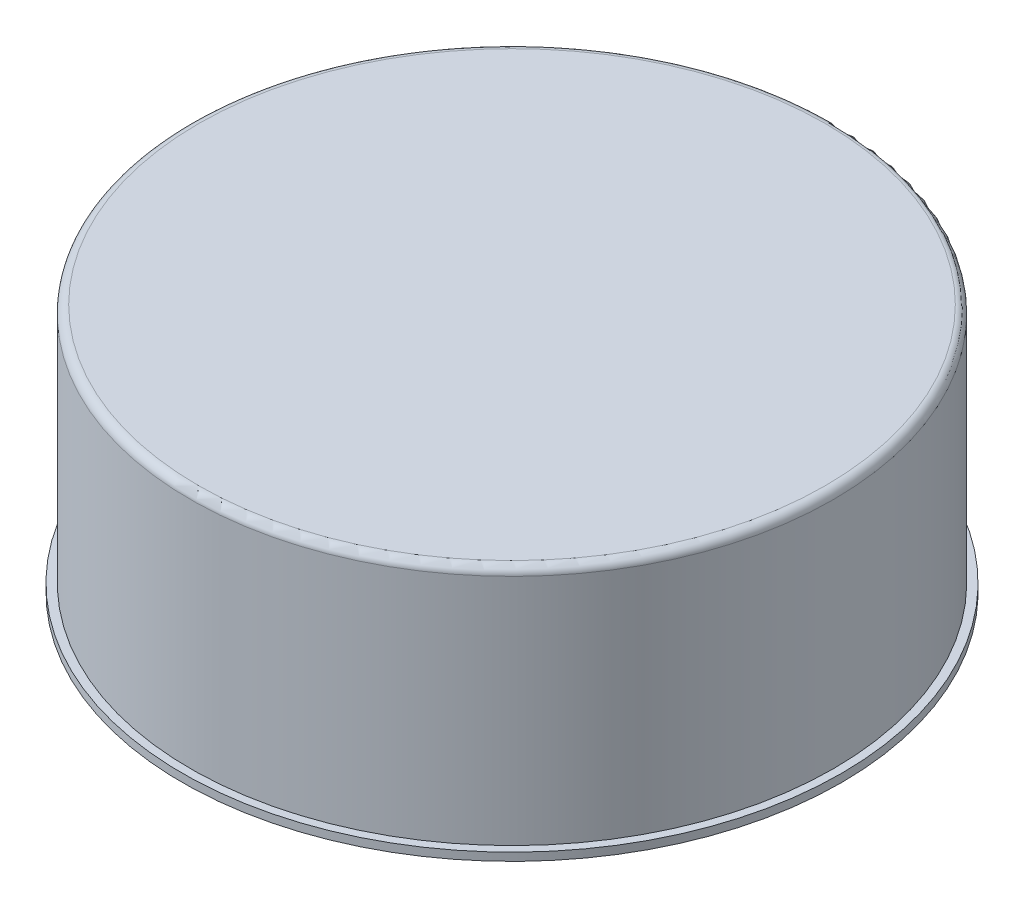
ISO-10303-21;
HEADER;
FILE_DESCRIPTION(('STEP AP214'),'2;1');
FILE_NAME('part.step','',(''),(''),'','','');
FILE_SCHEMA(('AUTOMOTIVE_DESIGN { 1 0 10303 214 1 1 1 1 }'));
ENDSEC;
DATA;
#1=APPLICATION_CONTEXT('core data for automotive mechanical design processes');
#2=APPLICATION_PROTOCOL_DEFINITION('international standard','automotive_design',2000,#1);
#3=PRODUCT_CONTEXT('',#1,'mechanical');
#4=PRODUCT('Part','Part','',(#3));
#5=PRODUCT_RELATED_PRODUCT_CATEGORY('part','',(#4));
#6=PRODUCT_DEFINITION_FORMATION('','',#4);
#7=PRODUCT_DEFINITION_CONTEXT('part definition',#1,'design');
#8=PRODUCT_DEFINITION('design','',#6,#7);
#9=PRODUCT_DEFINITION_SHAPE('','',#8);
#10=(LENGTH_UNIT() NAMED_UNIT(*) SI_UNIT(.MILLI.,.METRE.));
#11=(NAMED_UNIT(*) PLANE_ANGLE_UNIT() SI_UNIT($,.RADIAN.));
#12=(NAMED_UNIT(*) SI_UNIT($,.STERADIAN.) SOLID_ANGLE_UNIT());
#13=UNCERTAINTY_MEASURE_WITH_UNIT(LENGTH_MEASURE(1.E-05),#10,'distance_accuracy_value','');
#14=(GEOMETRIC_REPRESENTATION_CONTEXT(3) GLOBAL_UNCERTAINTY_ASSIGNED_CONTEXT((#13)) GLOBAL_UNIT_ASSIGNED_CONTEXT((#10,
#11,#12)) REPRESENTATION_CONTEXT('',''));
#15=CARTESIAN_POINT('',(0.,0.,0.));
#16=DIRECTION('',(0.,0.,1.));
#17=DIRECTION('',(1.,0.,0.));
#18=AXIS2_PLACEMENT_3D('',#15,#16,#17);
#19=CARTESIAN_POINT('',(0.,0.,0.));
#20=DIRECTION('',(0.,-1.,0.));
#21=DIRECTION('',(1.,0.,0.));
#22=AXIS2_PLACEMENT_3D('',#19,#20,#21);
#23=CYLINDRICAL_SURFACE('',#22,4100.);
#24=CARTESIAN_POINT('',(0.,-100.,0.));
#25=DIRECTION('',(0.,-1.,0.));
#26=DIRECTION('',(1.,0.,0.));
#27=AXIS2_PLACEMENT_3D('',#24,#25,#26);
#28=CIRCLE('',#27,4100.);
#29=CARTESIAN_POINT('',(4100.,-99.9999999999998,0.));
#30=VERTEX_POINT('',#29);
#31=EDGE_CURVE('E44',#30,#30,#28,.T.);
#32=ORIENTED_EDGE('',*,*,#31,.F.);
#33=EDGE_LOOP('',(#32));
#34=FACE_BOUND('',#33,.T.);
#35=CARTESIAN_POINT('',(0.,0.,0.));
#36=DIRECTION('',(0.,-1.,0.));
#37=DIRECTION('',(1.,0.,0.));
#38=AXIS2_PLACEMENT_3D('',#35,#36,#37);
#39=CIRCLE('',#38,4100.);
#40=CARTESIAN_POINT('',(4100.,1.67368395883472E-13,0.));
#41=VERTEX_POINT('',#40);
#42=EDGE_CURVE('E54',#41,#41,#39,.T.);
#43=ORIENTED_EDGE('',*,*,#42,.T.);
#44=EDGE_LOOP('',(#43));
#45=FACE_BOUND('',#44,.T.);
#46=ADVANCED_FACE('F37',(#34,#45),#23,.T.);
#47=CARTESIAN_POINT('',(-1.18382523917578E-13,2900.,0.));
#48=DIRECTION('',(0.,-1.,0.));
#49=DIRECTION('',(1.,0.,0.));
#50=AXIS2_PLACEMENT_3D('',#47,#48,#49);
#51=PLANE('',#50);
#52=CARTESIAN_POINT('',(-1.18382523917578E-13,2900.,0.));
#53=DIRECTION('',(0.,-1.,0.));
#54=DIRECTION('',(1.,0.,0.));
#55=AXIS2_PLACEMENT_3D('',#52,#53,#54);
#56=CIRCLE('',#55,3900.);
#57=CARTESIAN_POINT('',(3900.,2900.,0.));
#58=VERTEX_POINT('',#57);
#59=EDGE_CURVE('E10',#58,#58,#56,.T.);
#60=ORIENTED_EDGE('',*,*,#59,.T.);
#61=EDGE_LOOP('',(#60));
#62=FACE_BOUND('',#61,.T.);
#63=ADVANCED_FACE('F82',(#62),#51,.T.);
#64=CARTESIAN_POINT('',(-1.22464679914735E-13,3000.,0.));
#65=DIRECTION('',(0.,-1.,0.));
#66=DIRECTION('',(1.,0.,0.));
#67=AXIS2_PLACEMENT_3D('',#64,#65,#66);
#68=CYLINDRICAL_SURFACE('',#67,3900.);
#69=CARTESIAN_POINT('',(0.,-100.,0.));
#70=DIRECTION('',(0.,-1.,0.));
#71=DIRECTION('',(1.,0.,0.));
#72=AXIS2_PLACEMENT_3D('',#69,#70,#71);
#73=CIRCLE('',#72,3900.);
#74=CARTESIAN_POINT('',(3900.,-99.9999999999999,0.));
#75=VERTEX_POINT('',#74);
#76=EDGE_CURVE('E49',#75,#75,#73,.T.);
#77=ORIENTED_EDGE('',*,*,#76,.T.);
#78=EDGE_LOOP('',(#77));
#79=FACE_BOUND('',#78,.T.);
#80=ORIENTED_EDGE('',*,*,#59,.F.);
#81=EDGE_LOOP('',(#80));
#82=FACE_BOUND('',#81,.T.);
#83=ADVANCED_FACE('F78',(#79,#82),#68,.F.);
#84=CARTESIAN_POINT('',(4000.,-100.,0.));
#85=DIRECTION('',(0.,-1.,0.));
#86=DIRECTION('',(1.,0.,0.));
#87=AXIS2_PLACEMENT_3D('',#84,#85,#86);
#88=PLANE('',#87);
#89=ORIENTED_EDGE('',*,*,#31,.T.);
#90=EDGE_LOOP('',(#89));
#91=FACE_BOUND('',#90,.T.);
#92=ORIENTED_EDGE('',*,*,#76,.F.);
#93=EDGE_LOOP('',(#92));
#94=FACE_BOUND('',#93,.T.);
#95=ADVANCED_FACE('F70',(#91,#94),#88,.T.);
#96=CARTESIAN_POINT('',(-1.22464679914735E-13,3000.,0.));
#97=DIRECTION('',(0.,-1.,0.));
#98=DIRECTION('',(1.,0.,0.));
#99=AXIS2_PLACEMENT_3D('',#96,#97,#98);
#100=PLANE('',#99);
#101=CARTESIAN_POINT('',(-1.22464679914735E-13,3000.,0.));
#102=DIRECTION('',(0.,-1.,0.));
#103=DIRECTION('',(1.,0.,0.));
#104=AXIS2_PLACEMENT_3D('',#101,#102,#103);
#105=CIRCLE('',#104,3900.);
#106=CARTESIAN_POINT('',(3900.,3000.,0.));
#107=VERTEX_POINT('',#106);
#108=EDGE_CURVE('E40',#107,#107,#105,.T.);
#109=ORIENTED_EDGE('',*,*,#108,.F.);
#110=EDGE_LOOP('',(#109));
#111=FACE_BOUND('',#110,.T.);
#112=ADVANCED_FACE('F68',(#111),#100,.F.);
#113=CARTESIAN_POINT('',(0.,2900.,0.));
#114=DIRECTION('',(0.,-1.,0.));
#115=DIRECTION('',(1.,0.,0.));
#116=AXIS2_PLACEMENT_3D('',#113,#114,#115);
#117=TOROIDAL_SURFACE('',#116,3900.,100.);
#118=CARTESIAN_POINT('',(-1.18382523917577E-13,2900.,0.));
#119=DIRECTION('',(0.,-1.,0.));
#120=DIRECTION('',(1.,0.,0.));
#121=AXIS2_PLACEMENT_3D('',#118,#119,#120);
#122=CIRCLE('',#121,4000.);
#123=CARTESIAN_POINT('',(4000.,2900.,0.));
#124=VERTEX_POINT('',#123);
#125=EDGE_CURVE('E57',#124,#124,#122,.T.);
#126=ORIENTED_EDGE('',*,*,#125,.F.);
#127=EDGE_LOOP('',(#126));
#128=FACE_BOUND('',#127,.T.);
#129=ORIENTED_EDGE('',*,*,#108,.T.);
#130=EDGE_LOOP('',(#129));
#131=FACE_BOUND('',#130,.T.);
#132=ADVANCED_FACE('F66',(#128,#131),#117,.T.);
#133=CARTESIAN_POINT('',(-1.22464679914735E-13,3000.,0.));
#134=DIRECTION('',(0.,-1.,0.));
#135=DIRECTION('',(1.,0.,0.));
#136=AXIS2_PLACEMENT_3D('',#133,#134,#135);
#137=CYLINDRICAL_SURFACE('',#136,4000.);
#138=CARTESIAN_POINT('',(0.,0.,0.));
#139=DIRECTION('',(0.,-1.,0.));
#140=DIRECTION('',(1.,0.,0.));
#141=AXIS2_PLACEMENT_3D('',#138,#139,#140);
#142=CIRCLE('',#141,4000.);
#143=CARTESIAN_POINT('',(4000.,1.63286239886314E-13,0.));
#144=VERTEX_POINT('',#143);
#145=EDGE_CURVE('E58',#144,#144,#142,.T.);
#146=ORIENTED_EDGE('',*,*,#145,.F.);
#147=EDGE_LOOP('',(#146));
#148=FACE_BOUND('',#147,.T.);
#149=ORIENTED_EDGE('',*,*,#125,.T.);
#150=EDGE_LOOP('',(#149));
#151=FACE_BOUND('',#150,.T.);
#152=ADVANCED_FACE('F75',(#148,#151),#137,.T.);
#153=CARTESIAN_POINT('',(4000.,0.,0.));
#154=DIRECTION('',(0.,-1.,0.));
#155=DIRECTION('',(1.,0.,0.));
#156=AXIS2_PLACEMENT_3D('',#153,#154,#155);
#157=PLANE('',#156);
#158=ORIENTED_EDGE('',*,*,#42,.F.);
#159=EDGE_LOOP('',(#158));
#160=FACE_BOUND('',#159,.T.);
#161=ORIENTED_EDGE('',*,*,#145,.T.);
#162=EDGE_LOOP('',(#161));
#163=FACE_BOUND('',#162,.T.);
#164=ADVANCED_FACE('F92',(#160,#163),#157,.F.);
#165=CLOSED_SHELL('',(#46,#63,#83,#95,#112,#132,#152,#164));
#166=MANIFOLD_SOLID_BREP('B2',#165);
#167=ADVANCED_BREP_SHAPE_REPRESENTATION('',(#18,#166),#14);
#168=SHAPE_DEFINITION_REPRESENTATION(#9,#167);
ENDSEC;
END-ISO-10303-21;
